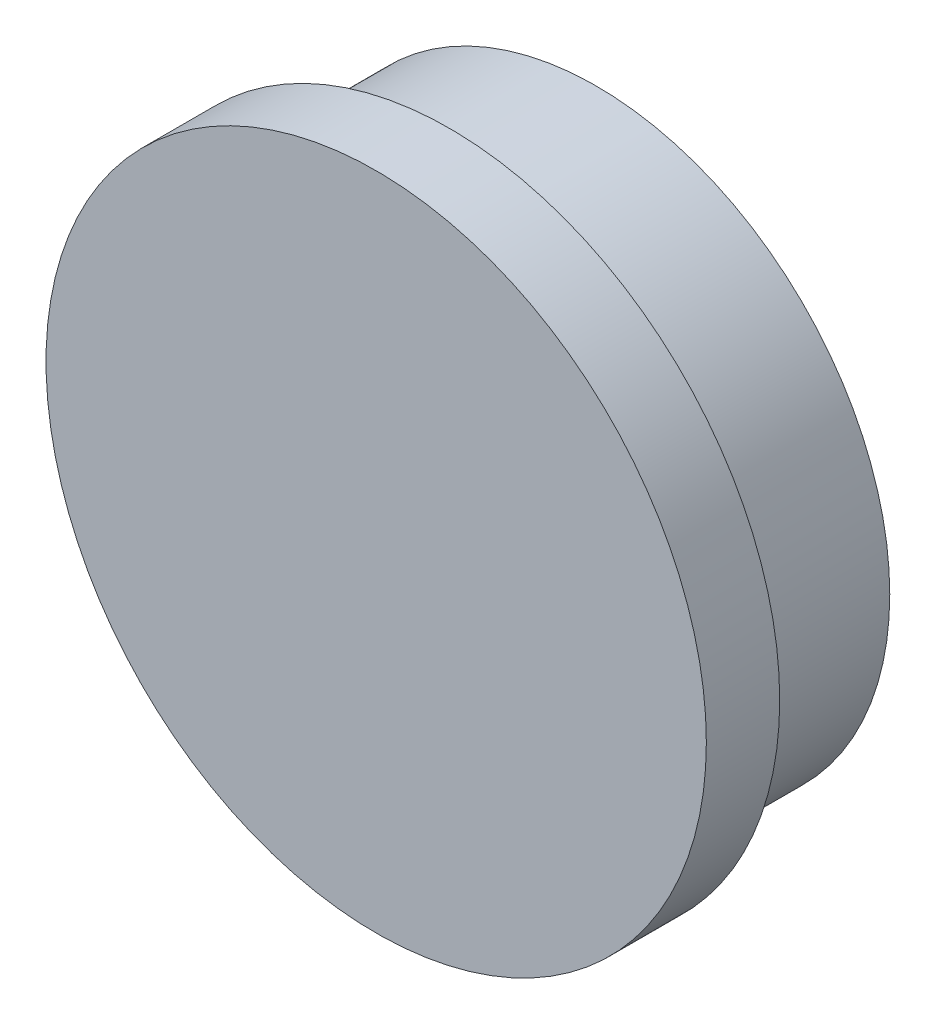
ISO-10303-21;
HEADER;
FILE_DESCRIPTION(('STEP AP214'),'2;1');
FILE_NAME('part.step','',(''),(''),'','','');
FILE_SCHEMA(('AUTOMOTIVE_DESIGN { 1 0 10303 214 1 1 1 1 }'));
ENDSEC;
DATA;
#1=APPLICATION_CONTEXT('core data for automotive mechanical design processes');
#2=APPLICATION_PROTOCOL_DEFINITION('international standard','automotive_design',2000,#1);
#3=PRODUCT_CONTEXT('',#1,'mechanical');
#4=PRODUCT('Part','Part','',(#3));
#5=PRODUCT_RELATED_PRODUCT_CATEGORY('part','',(#4));
#6=PRODUCT_DEFINITION_FORMATION('','',#4);
#7=PRODUCT_DEFINITION_CONTEXT('part definition',#1,'design');
#8=PRODUCT_DEFINITION('design','',#6,#7);
#9=PRODUCT_DEFINITION_SHAPE('','',#8);
#10=(LENGTH_UNIT() NAMED_UNIT(*) SI_UNIT(.MILLI.,.METRE.));
#11=(NAMED_UNIT(*) PLANE_ANGLE_UNIT() SI_UNIT($,.RADIAN.));
#12=(NAMED_UNIT(*) SI_UNIT($,.STERADIAN.) SOLID_ANGLE_UNIT());
#13=UNCERTAINTY_MEASURE_WITH_UNIT(LENGTH_MEASURE(1.E-05),#10,'distance_accuracy_value','');
#14=(GEOMETRIC_REPRESENTATION_CONTEXT(3) GLOBAL_UNCERTAINTY_ASSIGNED_CONTEXT((#13)) GLOBAL_UNIT_ASSIGNED_CONTEXT((#10,
#11,#12)) REPRESENTATION_CONTEXT('',''));
#15=CARTESIAN_POINT('',(0.,0.,0.));
#16=DIRECTION('',(0.,0.,1.));
#17=DIRECTION('',(1.,0.,0.));
#18=AXIS2_PLACEMENT_3D('',#15,#16,#17);
#19=CARTESIAN_POINT('',(0.,0.,2.5));
#20=DIRECTION('',(0.,0.,-1.));
#21=DIRECTION('',(-1.,0.,0.));
#22=AXIS2_PLACEMENT_3D('',#19,#20,#21);
#23=CYLINDRICAL_SURFACE('',#22,11.25);
#24=CARTESIAN_POINT('',(0.,0.,2.5));
#25=DIRECTION('',(0.,0.,1.));
#26=DIRECTION('',(1.,0.,0.));
#27=AXIS2_PLACEMENT_3D('',#24,#25,#26);
#28=CIRCLE('',#27,11.25);
#29=CARTESIAN_POINT('',(11.25,0.,2.5));
#30=VERTEX_POINT('',#29);
#31=EDGE_CURVE('E10',#30,#30,#28,.T.);
#32=ORIENTED_EDGE('',*,*,#31,.F.);
#33=EDGE_LOOP('',(#32));
#34=FACE_BOUND('',#33,.T.);
#35=CARTESIAN_POINT('',(0.,0.,0.));
#36=DIRECTION('',(0.,0.,1.));
#37=DIRECTION('',(1.,0.,0.));
#38=AXIS2_PLACEMENT_3D('',#35,#36,#37);
#39=CIRCLE('',#38,11.25);
#40=CARTESIAN_POINT('',(11.25,0.,0.));
#41=VERTEX_POINT('',#40);
#42=EDGE_CURVE('E45',#41,#41,#39,.T.);
#43=ORIENTED_EDGE('',*,*,#42,.T.);
#44=EDGE_LOOP('',(#43));
#45=FACE_BOUND('',#44,.T.);
#46=ADVANCED_FACE('F37',(#34,#45),#23,.T.);
#47=CARTESIAN_POINT('',(0.,0.,2.5));
#48=DIRECTION('',(0.,0.,1.));
#49=DIRECTION('',(1.,0.,0.));
#50=AXIS2_PLACEMENT_3D('',#47,#48,#49);
#51=PLANE('',#50);
#52=ORIENTED_EDGE('',*,*,#31,.T.);
#53=EDGE_LOOP('',(#52));
#54=FACE_BOUND('',#53,.T.);
#55=ADVANCED_FACE('F74',(#54),#51,.T.);
#56=CARTESIAN_POINT('',(0.,0.,0.));
#57=DIRECTION('',(0.,0.,1.));
#58=DIRECTION('',(1.,0.,0.));
#59=AXIS2_PLACEMENT_3D('',#56,#57,#58);
#60=PLANE('',#59);
#61=CARTESIAN_POINT('',(0.,0.,0.));
#62=DIRECTION('',(0.,0.,1.));
#63=DIRECTION('',(1.,0.,0.));
#64=AXIS2_PLACEMENT_3D('',#61,#62,#63);
#65=CIRCLE('',#64,10.);
#66=CARTESIAN_POINT('',(10.,0.,0.));
#67=VERTEX_POINT('',#66);
#68=EDGE_CURVE('E40',#67,#67,#65,.T.);
#69=ORIENTED_EDGE('',*,*,#68,.T.);
#70=EDGE_LOOP('',(#69));
#71=FACE_BOUND('',#70,.T.);
#72=ORIENTED_EDGE('',*,*,#42,.F.);
#73=EDGE_LOOP('',(#72));
#74=FACE_BOUND('',#73,.T.);
#75=ADVANCED_FACE('F61',(#71,#74),#60,.F.);
#76=CARTESIAN_POINT('',(0.,0.,-5.));
#77=DIRECTION('',(0.,0.,1.));
#78=DIRECTION('',(1.,0.,0.));
#79=AXIS2_PLACEMENT_3D('',#76,#77,#78);
#80=CYLINDRICAL_SURFACE('',#79,10.);
#81=CARTESIAN_POINT('',(0.,0.,-5.));
#82=DIRECTION('',(0.,0.,1.));
#83=DIRECTION('',(1.,0.,0.));
#84=AXIS2_PLACEMENT_3D('',#81,#82,#83);
#85=CIRCLE('',#84,10.);
#86=CARTESIAN_POINT('',(10.,0.,-5.));
#87=VERTEX_POINT('',#86);
#88=EDGE_CURVE('E52',#87,#87,#85,.T.);
#89=ORIENTED_EDGE('',*,*,#88,.T.);
#90=EDGE_LOOP('',(#89));
#91=FACE_BOUND('',#90,.T.);
#92=ORIENTED_EDGE('',*,*,#68,.F.);
#93=EDGE_LOOP('',(#92));
#94=FACE_BOUND('',#93,.T.);
#95=ADVANCED_FACE('F64',(#91,#94),#80,.T.);
#96=CARTESIAN_POINT('',(0.,0.,-5.));
#97=DIRECTION('',(0.,0.,1.));
#98=DIRECTION('',(1.,0.,0.));
#99=AXIS2_PLACEMENT_3D('',#96,#97,#98);
#100=PLANE('',#99);
#101=ORIENTED_EDGE('',*,*,#88,.F.);
#102=EDGE_LOOP('',(#101));
#103=FACE_BOUND('',#102,.T.);
#104=ADVANCED_FACE('F66',(#103),#100,.F.);
#105=CLOSED_SHELL('',(#46,#55,#75,#95,#104));
#106=MANIFOLD_SOLID_BREP('B2',#105);
#107=ADVANCED_BREP_SHAPE_REPRESENTATION('',(#18,#106),#14);
#108=SHAPE_DEFINITION_REPRESENTATION(#9,#107);
ENDSEC;
END-ISO-10303-21;
